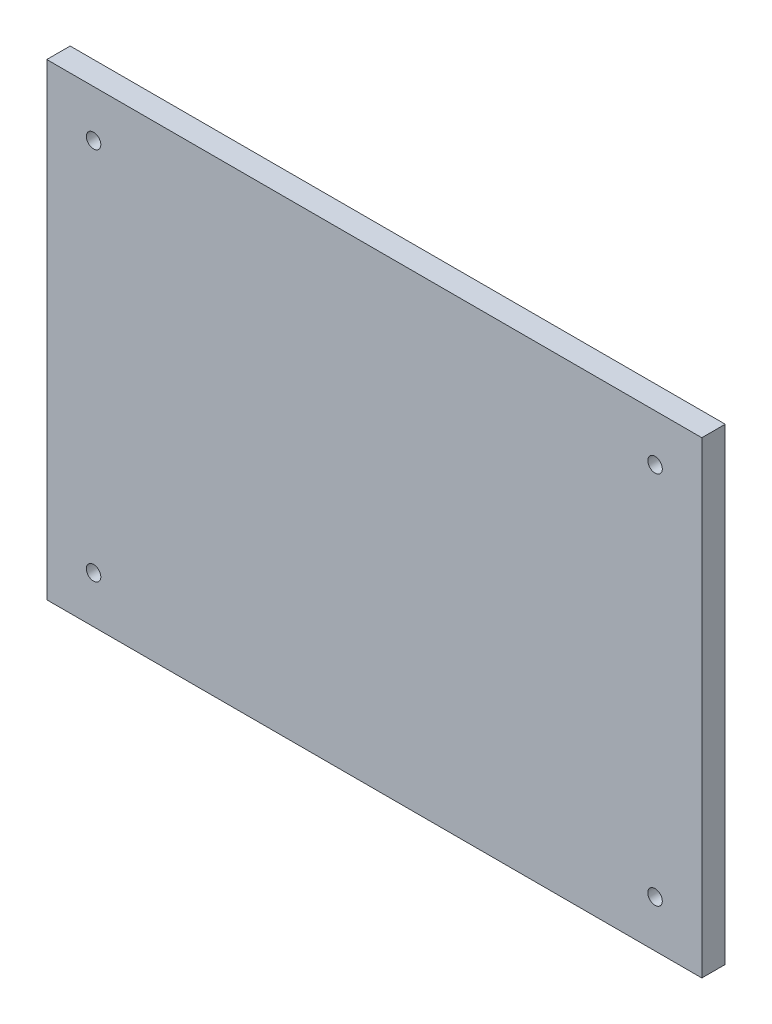
ISO-10303-21;
HEADER;
FILE_DESCRIPTION(('STEP AP214'),'2;1');
FILE_NAME('part.step','',(''),(''),'','','');
FILE_SCHEMA(('AUTOMOTIVE_DESIGN { 1 0 10303 214 1 1 1 1 }'));
ENDSEC;
DATA;
#1=APPLICATION_CONTEXT('core data for automotive mechanical design processes');
#2=APPLICATION_PROTOCOL_DEFINITION('international standard','automotive_design',2000,#1);
#3=PRODUCT_CONTEXT('',#1,'mechanical');
#4=PRODUCT('Part','Part','',(#3));
#5=PRODUCT_RELATED_PRODUCT_CATEGORY('part','',(#4));
#6=PRODUCT_DEFINITION_FORMATION('','',#4);
#7=PRODUCT_DEFINITION_CONTEXT('part definition',#1,'design');
#8=PRODUCT_DEFINITION('design','',#6,#7);
#9=PRODUCT_DEFINITION_SHAPE('','',#8);
#10=(LENGTH_UNIT() NAMED_UNIT(*) SI_UNIT(.MILLI.,.METRE.));
#11=(NAMED_UNIT(*) PLANE_ANGLE_UNIT() SI_UNIT($,.RADIAN.));
#12=(NAMED_UNIT(*) SI_UNIT($,.STERADIAN.) SOLID_ANGLE_UNIT());
#13=UNCERTAINTY_MEASURE_WITH_UNIT(LENGTH_MEASURE(1.E-05),#10,'distance_accuracy_value','');
#14=(GEOMETRIC_REPRESENTATION_CONTEXT(3) GLOBAL_UNCERTAINTY_ASSIGNED_CONTEXT((#13)) GLOBAL_UNIT_ASSIGNED_CONTEXT((#10,
#11,#12)) REPRESENTATION_CONTEXT('',''));
#15=CARTESIAN_POINT('',(0.,0.,0.));
#16=DIRECTION('',(0.,0.,1.));
#17=DIRECTION('',(1.,0.,0.));
#18=AXIS2_PLACEMENT_3D('',#15,#16,#17);
#19=CARTESIAN_POINT('',(70.,-50.,-5.));
#20=DIRECTION('',(1.,0.,0.));
#21=DIRECTION('',(0.,0.,-1.));
#22=AXIS2_PLACEMENT_3D('',#19,#20,#21);
#23=PLANE('',#22);
#24=DIRECTION('',(0.,1.,0.));
#25=VECTOR('',#24,1.);
#26=CARTESIAN_POINT('',(70.,-50.,0.));
#27=LINE('',#26,#25);
#28=CARTESIAN_POINT('',(70.,-50.,0.));
#29=VERTEX_POINT('',#28);
#30=CARTESIAN_POINT('',(70.,50.,0.));
#31=VERTEX_POINT('',#30);
#32=EDGE_CURVE('E98',#29,#31,#27,.T.);
#33=ORIENTED_EDGE('',*,*,#32,.F.);
#34=DIRECTION('',(0.,0.,1.));
#35=VECTOR('',#34,1.);
#36=CARTESIAN_POINT('',(70.,-50.,-5.));
#37=LINE('',#36,#35);
#38=CARTESIAN_POINT('',(70.,-50.,-5.));
#39=VERTEX_POINT('',#38);
#40=EDGE_CURVE('E11',#39,#29,#37,.T.);
#41=ORIENTED_EDGE('',*,*,#40,.F.);
#42=DIRECTION('',(0.,1.,0.));
#43=VECTOR('',#42,1.);
#44=CARTESIAN_POINT('',(70.,-50.,-5.));
#45=LINE('',#44,#43);
#46=CARTESIAN_POINT('',(70.,50.,-5.));
#47=VERTEX_POINT('',#46);
#48=EDGE_CURVE('E91',#39,#47,#45,.T.);
#49=ORIENTED_EDGE('',*,*,#48,.T.);
#50=DIRECTION('',(0.,0.,1.));
#51=VECTOR('',#50,1.);
#52=CARTESIAN_POINT('',(70.,50.,-5.));
#53=LINE('',#52,#51);
#54=EDGE_CURVE('E36',#47,#31,#53,.T.);
#55=ORIENTED_EDGE('',*,*,#54,.T.);
#56=EDGE_LOOP('',(#33,#41,#49,#55));
#57=FACE_BOUND('',#56,.T.);
#58=ADVANCED_FACE('F33',(#57),#23,.T.);
#59=CARTESIAN_POINT('',(-70.,-50.,-5.));
#60=DIRECTION('',(0.,-1.,0.));
#61=DIRECTION('',(0.,0.,-1.));
#62=AXIS2_PLACEMENT_3D('',#59,#60,#61);
#63=PLANE('',#62);
#64=DIRECTION('',(1.,0.,0.));
#65=VECTOR('',#64,1.);
#66=CARTESIAN_POINT('',(-70.,-50.,0.));
#67=LINE('',#66,#65);
#68=CARTESIAN_POINT('',(-70.,-50.,0.));
#69=VERTEX_POINT('',#68);
#70=EDGE_CURVE('E93',#69,#29,#67,.T.);
#71=ORIENTED_EDGE('',*,*,#70,.F.);
#72=DIRECTION('',(0.,0.,1.));
#73=VECTOR('',#72,1.);
#74=CARTESIAN_POINT('',(-70.,-50.,-5.));
#75=LINE('',#74,#73);
#76=CARTESIAN_POINT('',(-70.,-50.,-5.));
#77=VERTEX_POINT('',#76);
#78=EDGE_CURVE('E42',#77,#69,#75,.T.);
#79=ORIENTED_EDGE('',*,*,#78,.F.);
#80=DIRECTION('',(1.,0.,0.));
#81=VECTOR('',#80,1.);
#82=CARTESIAN_POINT('',(-70.,-50.,-5.));
#83=LINE('',#82,#81);
#84=EDGE_CURVE('E88',#77,#39,#83,.T.);
#85=ORIENTED_EDGE('',*,*,#84,.T.);
#86=ORIENTED_EDGE('',*,*,#40,.T.);
#87=EDGE_LOOP('',(#71,#79,#85,#86));
#88=FACE_BOUND('',#87,.T.);
#89=ADVANCED_FACE('F109',(#88),#63,.T.);
#90=CARTESIAN_POINT('',(-70.,-50.,-5.));
#91=DIRECTION('',(-1.,0.,0.));
#92=DIRECTION('',(0.,0.,1.));
#93=AXIS2_PLACEMENT_3D('',#90,#91,#92);
#94=PLANE('',#93);
#95=DIRECTION('',(0.,-1.,0.));
#96=VECTOR('',#95,1.);
#97=CARTESIAN_POINT('',(-70.,-50.,0.));
#98=LINE('',#97,#96);
#99=CARTESIAN_POINT('',(-70.,50.,0.));
#100=VERTEX_POINT('',#99);
#101=EDGE_CURVE('E83',#100,#69,#98,.T.);
#102=ORIENTED_EDGE('',*,*,#101,.F.);
#103=DIRECTION('',(0.,0.,1.));
#104=VECTOR('',#103,1.);
#105=CARTESIAN_POINT('',(-70.,50.,-5.));
#106=LINE('',#105,#104);
#107=CARTESIAN_POINT('',(-70.,50.,-5.));
#108=VERTEX_POINT('',#107);
#109=EDGE_CURVE('E78',#108,#100,#106,.T.);
#110=ORIENTED_EDGE('',*,*,#109,.F.);
#111=DIRECTION('',(0.,-1.,0.));
#112=VECTOR('',#111,1.);
#113=CARTESIAN_POINT('',(-70.,-50.,-5.));
#114=LINE('',#113,#112);
#115=EDGE_CURVE('E81',#108,#77,#114,.T.);
#116=ORIENTED_EDGE('',*,*,#115,.T.);
#117=ORIENTED_EDGE('',*,*,#78,.T.);
#118=EDGE_LOOP('',(#102,#110,#116,#117));
#119=FACE_BOUND('',#118,.T.);
#120=ADVANCED_FACE('F80',(#119),#94,.T.);
#121=CARTESIAN_POINT('',(-70.,50.,-5.));
#122=DIRECTION('',(0.,1.,0.));
#123=DIRECTION('',(0.,0.,1.));
#124=AXIS2_PLACEMENT_3D('',#121,#122,#123);
#125=PLANE('',#124);
#126=DIRECTION('',(-1.,0.,0.));
#127=VECTOR('',#126,1.);
#128=CARTESIAN_POINT('',(-70.,50.,0.));
#129=LINE('',#128,#127);
#130=EDGE_CURVE('E101',#31,#100,#129,.T.);
#131=ORIENTED_EDGE('',*,*,#130,.F.);
#132=ORIENTED_EDGE('',*,*,#54,.F.);
#133=DIRECTION('',(-1.,0.,0.));
#134=VECTOR('',#133,1.);
#135=CARTESIAN_POINT('',(-70.,50.,-5.));
#136=LINE('',#135,#134);
#137=EDGE_CURVE('E87',#47,#108,#136,.T.);
#138=ORIENTED_EDGE('',*,*,#137,.T.);
#139=ORIENTED_EDGE('',*,*,#109,.T.);
#140=EDGE_LOOP('',(#131,#132,#138,#139));
#141=FACE_BOUND('',#140,.T.);
#142=ADVANCED_FACE('F90',(#141),#125,.T.);
#143=CARTESIAN_POINT('',(0.,0.,-5.));
#144=DIRECTION('',(0.,0.,-1.));
#145=DIRECTION('',(-1.,0.,0.));
#146=AXIS2_PLACEMENT_3D('',#143,#144,#145);
#147=PLANE('',#146);
#148=CARTESIAN_POINT('',(-60.,40.,-5.));
#149=DIRECTION('',(0.,0.,1.));
#150=DIRECTION('',(-1.,0.,0.));
#151=AXIS2_PLACEMENT_3D('',#148,#149,#150);
#152=CIRCLE('',#151,1.55);
#153=CARTESIAN_POINT('',(-61.55,40.,-5.));
#154=VERTEX_POINT('',#153);
#155=EDGE_CURVE('E150',#154,#154,#152,.T.);
#156=ORIENTED_EDGE('',*,*,#155,.T.);
#157=EDGE_LOOP('',(#156));
#158=FACE_BOUND('',#157,.T.);
#159=CARTESIAN_POINT('',(60.,40.,-5.));
#160=DIRECTION('',(0.,0.,1.));
#161=DIRECTION('',(1.,0.,0.));
#162=AXIS2_PLACEMENT_3D('',#159,#160,#161);
#163=CIRCLE('',#162,1.55);
#164=CARTESIAN_POINT('',(61.55,40.,-5.));
#165=VERTEX_POINT('',#164);
#166=EDGE_CURVE('E158',#165,#165,#163,.T.);
#167=ORIENTED_EDGE('',*,*,#166,.T.);
#168=EDGE_LOOP('',(#167));
#169=FACE_BOUND('',#168,.T.);
#170=CARTESIAN_POINT('',(60.,-40.,-5.));
#171=DIRECTION('',(0.,0.,1.));
#172=DIRECTION('',(-1.,0.,0.));
#173=AXIS2_PLACEMENT_3D('',#170,#171,#172);
#174=CIRCLE('',#173,1.55);
#175=CARTESIAN_POINT('',(58.45,-40.,-5.));
#176=VERTEX_POINT('',#175);
#177=EDGE_CURVE('E164',#176,#176,#174,.T.);
#178=ORIENTED_EDGE('',*,*,#177,.T.);
#179=EDGE_LOOP('',(#178));
#180=FACE_BOUND('',#179,.T.);
#181=CARTESIAN_POINT('',(-60.,-40.,-5.));
#182=DIRECTION('',(0.,0.,1.));
#183=DIRECTION('',(1.,0.,0.));
#184=AXIS2_PLACEMENT_3D('',#181,#182,#183);
#185=CIRCLE('',#184,1.55);
#186=CARTESIAN_POINT('',(-58.45,-40.,-5.));
#187=VERTEX_POINT('',#186);
#188=EDGE_CURVE('E102',#187,#187,#185,.T.);
#189=ORIENTED_EDGE('',*,*,#188,.T.);
#190=EDGE_LOOP('',(#189));
#191=FACE_BOUND('',#190,.T.);
#192=ORIENTED_EDGE('',*,*,#48,.F.);
#193=ORIENTED_EDGE('',*,*,#84,.F.);
#194=ORIENTED_EDGE('',*,*,#115,.F.);
#195=ORIENTED_EDGE('',*,*,#137,.F.);
#196=EDGE_LOOP('',(#192,#193,#194,#195));
#197=FACE_BOUND('',#196,.T.);
#198=ADVANCED_FACE('F86',(#158,#169,#180,#191,#197),#147,.T.);
#199=CARTESIAN_POINT('',(0.,0.,0.));
#200=DIRECTION('',(0.,0.,-1.));
#201=DIRECTION('',(-1.,0.,0.));
#202=AXIS2_PLACEMENT_3D('',#199,#200,#201);
#203=PLANE('',#202);
#204=CARTESIAN_POINT('',(-60.,40.,0.));
#205=DIRECTION('',(0.,0.,1.));
#206=DIRECTION('',(-1.,0.,0.));
#207=AXIS2_PLACEMENT_3D('',#204,#205,#206);
#208=CIRCLE('',#207,1.55);
#209=CARTESIAN_POINT('',(-61.55,40.,0.));
#210=VERTEX_POINT('',#209);
#211=EDGE_CURVE('E153',#210,#210,#208,.T.);
#212=ORIENTED_EDGE('',*,*,#211,.F.);
#213=EDGE_LOOP('',(#212));
#214=FACE_BOUND('',#213,.T.);
#215=CARTESIAN_POINT('',(60.,40.,0.));
#216=DIRECTION('',(0.,0.,1.));
#217=DIRECTION('',(1.,0.,0.));
#218=AXIS2_PLACEMENT_3D('',#215,#216,#217);
#219=CIRCLE('',#218,1.55);
#220=CARTESIAN_POINT('',(61.55,40.,0.));
#221=VERTEX_POINT('',#220);
#222=EDGE_CURVE('E155',#221,#221,#219,.T.);
#223=ORIENTED_EDGE('',*,*,#222,.F.);
#224=EDGE_LOOP('',(#223));
#225=FACE_BOUND('',#224,.T.);
#226=CARTESIAN_POINT('',(60.,-40.,0.));
#227=DIRECTION('',(0.,0.,1.));
#228=DIRECTION('',(-1.,0.,0.));
#229=AXIS2_PLACEMENT_3D('',#226,#227,#228);
#230=CIRCLE('',#229,1.55);
#231=CARTESIAN_POINT('',(58.45,-40.,0.));
#232=VERTEX_POINT('',#231);
#233=EDGE_CURVE('E161',#232,#232,#230,.T.);
#234=ORIENTED_EDGE('',*,*,#233,.F.);
#235=EDGE_LOOP('',(#234));
#236=FACE_BOUND('',#235,.T.);
#237=CARTESIAN_POINT('',(-60.,-40.,0.));
#238=DIRECTION('',(0.,0.,1.));
#239=DIRECTION('',(1.,0.,0.));
#240=AXIS2_PLACEMENT_3D('',#237,#238,#239);
#241=CIRCLE('',#240,1.55);
#242=CARTESIAN_POINT('',(-58.45,-40.,0.));
#243=VERTEX_POINT('',#242);
#244=EDGE_CURVE('E167',#243,#243,#241,.T.);
#245=ORIENTED_EDGE('',*,*,#244,.F.);
#246=EDGE_LOOP('',(#245));
#247=FACE_BOUND('',#246,.T.);
#248=ORIENTED_EDGE('',*,*,#32,.T.);
#249=ORIENTED_EDGE('',*,*,#130,.T.);
#250=ORIENTED_EDGE('',*,*,#101,.T.);
#251=ORIENTED_EDGE('',*,*,#70,.T.);
#252=EDGE_LOOP('',(#248,#249,#250,#251));
#253=FACE_BOUND('',#252,.T.);
#254=ADVANCED_FACE('F108',(#214,#225,#236,#247,#253),#203,.F.);
#255=CARTESIAN_POINT('',(-60.,-40.,-5.));
#256=DIRECTION('',(0.,0.,1.));
#257=DIRECTION('',(1.,0.,0.));
#258=AXIS2_PLACEMENT_3D('',#255,#256,#257);
#259=CYLINDRICAL_SURFACE('',#258,1.55);
#260=ORIENTED_EDGE('',*,*,#188,.F.);
#261=EDGE_LOOP('',(#260));
#262=FACE_BOUND('',#261,.T.);
#263=ORIENTED_EDGE('',*,*,#244,.T.);
#264=EDGE_LOOP('',(#263));
#265=FACE_BOUND('',#264,.T.);
#266=ADVANCED_FACE('F127',(#262,#265),#259,.F.);
#267=CARTESIAN_POINT('',(60.,-40.,-5.));
#268=DIRECTION('',(0.,0.,1.));
#269=DIRECTION('',(1.,0.,0.));
#270=AXIS2_PLACEMENT_3D('',#267,#268,#269);
#271=CYLINDRICAL_SURFACE('',#270,1.55);
#272=ORIENTED_EDGE('',*,*,#177,.F.);
#273=EDGE_LOOP('',(#272));
#274=FACE_BOUND('',#273,.T.);
#275=ORIENTED_EDGE('',*,*,#233,.T.);
#276=EDGE_LOOP('',(#275));
#277=FACE_BOUND('',#276,.T.);
#278=ADVANCED_FACE('F134',(#274,#277),#271,.F.);
#279=CARTESIAN_POINT('',(60.,40.,-5.));
#280=DIRECTION('',(0.,0.,1.));
#281=DIRECTION('',(1.,0.,0.));
#282=AXIS2_PLACEMENT_3D('',#279,#280,#281);
#283=CYLINDRICAL_SURFACE('',#282,1.55);
#284=ORIENTED_EDGE('',*,*,#166,.F.);
#285=EDGE_LOOP('',(#284));
#286=FACE_BOUND('',#285,.T.);
#287=ORIENTED_EDGE('',*,*,#222,.T.);
#288=EDGE_LOOP('',(#287));
#289=FACE_BOUND('',#288,.T.);
#290=ADVANCED_FACE('F138',(#286,#289),#283,.F.);
#291=CARTESIAN_POINT('',(-60.,40.,-5.));
#292=DIRECTION('',(0.,0.,1.));
#293=DIRECTION('',(1.,0.,0.));
#294=AXIS2_PLACEMENT_3D('',#291,#292,#293);
#295=CYLINDRICAL_SURFACE('',#294,1.55);
#296=ORIENTED_EDGE('',*,*,#155,.F.);
#297=EDGE_LOOP('',(#296));
#298=FACE_BOUND('',#297,.T.);
#299=ORIENTED_EDGE('',*,*,#211,.T.);
#300=EDGE_LOOP('',(#299));
#301=FACE_BOUND('',#300,.T.);
#302=ADVANCED_FACE('F142',(#298,#301),#295,.F.);
#303=CLOSED_SHELL('',(#58,#89,#120,#142,#198,#254,#266,#278,#290,#302));
#304=MANIFOLD_SOLID_BREP('B2',#303);
#305=ADVANCED_BREP_SHAPE_REPRESENTATION('',(#18,#304),#14);
#306=SHAPE_DEFINITION_REPRESENTATION(#9,#305);
ENDSEC;
END-ISO-10303-21;
